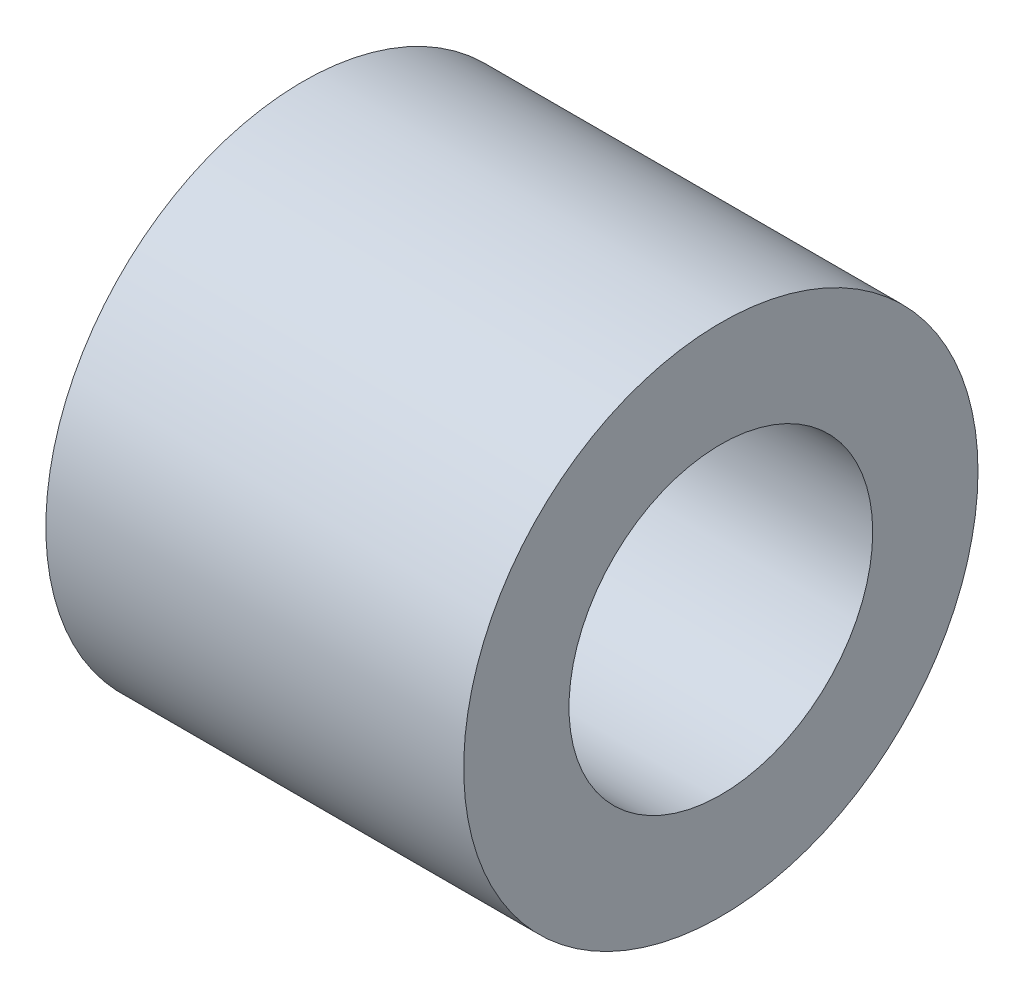
ISO-10303-21;
HEADER;
FILE_DESCRIPTION(('STEP AP214'),'2;1');
FILE_NAME('part.step','',(''),(''),'','','');
FILE_SCHEMA(('AUTOMOTIVE_DESIGN { 1 0 10303 214 1 1 1 1 }'));
ENDSEC;
DATA;
#1=APPLICATION_CONTEXT('core data for automotive mechanical design processes');
#2=APPLICATION_PROTOCOL_DEFINITION('international standard','automotive_design',2000,#1);
#3=PRODUCT_CONTEXT('',#1,'mechanical');
#4=PRODUCT('Part','Part','',(#3));
#5=PRODUCT_RELATED_PRODUCT_CATEGORY('part','',(#4));
#6=PRODUCT_DEFINITION_FORMATION('','',#4);
#7=PRODUCT_DEFINITION_CONTEXT('part definition',#1,'design');
#8=PRODUCT_DEFINITION('design','',#6,#7);
#9=PRODUCT_DEFINITION_SHAPE('','',#8);
#10=(LENGTH_UNIT() NAMED_UNIT(*) SI_UNIT(.MILLI.,.METRE.));
#11=(NAMED_UNIT(*) PLANE_ANGLE_UNIT() SI_UNIT($,.RADIAN.));
#12=(NAMED_UNIT(*) SI_UNIT($,.STERADIAN.) SOLID_ANGLE_UNIT());
#13=UNCERTAINTY_MEASURE_WITH_UNIT(LENGTH_MEASURE(1.E-05),#10,'distance_accuracy_value','');
#14=(GEOMETRIC_REPRESENTATION_CONTEXT(3) GLOBAL_UNCERTAINTY_ASSIGNED_CONTEXT((#13)) GLOBAL_UNIT_ASSIGNED_CONTEXT((#10,
#11,#12)) REPRESENTATION_CONTEXT('',''));
#15=CARTESIAN_POINT('',(0.,0.,0.));
#16=DIRECTION('',(0.,0.,1.));
#17=DIRECTION('',(1.,0.,0.));
#18=AXIS2_PLACEMENT_3D('',#15,#16,#17);
#19=CARTESIAN_POINT('',(-3.175,0.,0.));
#20=DIRECTION('',(1.,0.,0.));
#21=DIRECTION('',(0.,0.,-1.));
#22=AXIS2_PLACEMENT_3D('',#19,#20,#21);
#23=CYLINDRICAL_SURFACE('',#22,3.175);
#24=CARTESIAN_POINT('',(-3.175,0.,0.));
#25=DIRECTION('',(1.,0.,0.));
#26=DIRECTION('',(0.,0.,-1.));
#27=AXIS2_PLACEMENT_3D('',#24,#25,#26);
#28=CIRCLE('',#27,3.175);
#29=CARTESIAN_POINT('',(-3.175,0.,-3.175));
#30=VERTEX_POINT('',#29);
#31=EDGE_CURVE('E51',#30,#30,#28,.T.);
#32=ORIENTED_EDGE('',*,*,#31,.F.);
#33=EDGE_LOOP('',(#32));
#34=FACE_BOUND('',#33,.T.);
#35=CARTESIAN_POINT('',(0.,0.,0.));
#36=DIRECTION('',(1.,0.,0.));
#37=DIRECTION('',(0.,0.,-1.));
#38=AXIS2_PLACEMENT_3D('',#35,#36,#37);
#39=CIRCLE('',#38,3.175);
#40=CARTESIAN_POINT('',(0.,0.,-3.175));
#41=VERTEX_POINT('',#40);
#42=EDGE_CURVE('E46',#41,#41,#39,.T.);
#43=ORIENTED_EDGE('',*,*,#42,.T.);
#44=EDGE_LOOP('',(#43));
#45=FACE_BOUND('',#44,.T.);
#46=ADVANCED_FACE('F43',(#34,#45),#23,.F.);
#47=CARTESIAN_POINT('',(-3.175,0.,0.));
#48=DIRECTION('',(1.,0.,0.));
#49=DIRECTION('',(0.,0.,-1.));
#50=AXIS2_PLACEMENT_3D('',#47,#48,#49);
#51=CYLINDRICAL_SURFACE('',#50,5.08);
#52=CARTESIAN_POINT('',(-3.175,0.,0.));
#53=DIRECTION('',(1.,0.,0.));
#54=DIRECTION('',(0.,0.,-1.));
#55=AXIS2_PLACEMENT_3D('',#52,#53,#54);
#56=CIRCLE('',#55,5.08);
#57=CARTESIAN_POINT('',(-3.175,0.,-5.08));
#58=VERTEX_POINT('',#57);
#59=EDGE_CURVE('E10',#58,#58,#56,.T.);
#60=ORIENTED_EDGE('',*,*,#59,.T.);
#61=EDGE_LOOP('',(#60));
#62=FACE_BOUND('',#61,.T.);
#63=CARTESIAN_POINT('',(5.08,0.,0.));
#64=DIRECTION('',(1.,0.,0.));
#65=DIRECTION('',(0.,0.,-1.));
#66=AXIS2_PLACEMENT_3D('',#63,#64,#65);
#67=CIRCLE('',#66,5.08);
#68=CARTESIAN_POINT('',(5.08,0.,-5.08));
#69=VERTEX_POINT('',#68);
#70=EDGE_CURVE('E61',#69,#69,#67,.T.);
#71=ORIENTED_EDGE('',*,*,#70,.F.);
#72=EDGE_LOOP('',(#71));
#73=FACE_BOUND('',#72,.T.);
#74=ADVANCED_FACE('F79',(#62,#73),#51,.T.);
#75=CARTESIAN_POINT('',(-3.175,0.,0.));
#76=DIRECTION('',(1.,0.,0.));
#77=DIRECTION('',(0.,0.,-1.));
#78=AXIS2_PLACEMENT_3D('',#75,#76,#77);
#79=PLANE('',#78);
#80=ORIENTED_EDGE('',*,*,#31,.T.);
#81=EDGE_LOOP('',(#80));
#82=FACE_BOUND('',#81,.T.);
#83=ORIENTED_EDGE('',*,*,#59,.F.);
#84=EDGE_LOOP('',(#83));
#85=FACE_BOUND('',#84,.T.);
#86=ADVANCED_FACE('F85',(#82,#85),#79,.F.);
#87=CARTESIAN_POINT('',(0.,0.,0.));
#88=DIRECTION('',(1.,0.,0.));
#89=DIRECTION('',(0.,0.,-1.));
#90=AXIS2_PLACEMENT_3D('',#87,#88,#89);
#91=PLANE('',#90);
#92=CARTESIAN_POINT('',(0.,0.,0.));
#93=DIRECTION('',(1.,0.,0.));
#94=DIRECTION('',(0.,0.,-1.));
#95=AXIS2_PLACEMENT_3D('',#92,#93,#94);
#96=CIRCLE('',#95,3.);
#97=CARTESIAN_POINT('',(0.,0.,-3.));
#98=VERTEX_POINT('',#97);
#99=EDGE_CURVE('E59',#98,#98,#96,.T.);
#100=ORIENTED_EDGE('',*,*,#99,.T.);
#101=EDGE_LOOP('',(#100));
#102=FACE_BOUND('',#101,.T.);
#103=ORIENTED_EDGE('',*,*,#42,.F.);
#104=EDGE_LOOP('',(#103));
#105=FACE_BOUND('',#104,.T.);
#106=ADVANCED_FACE('F90',(#102,#105),#91,.F.);
#107=CARTESIAN_POINT('',(5.08,0.,0.));
#108=DIRECTION('',(-1.,0.,0.));
#109=DIRECTION('',(0.,0.,1.));
#110=AXIS2_PLACEMENT_3D('',#107,#108,#109);
#111=CYLINDRICAL_SURFACE('',#110,3.);
#112=CARTESIAN_POINT('',(5.08,0.,0.));
#113=DIRECTION('',(1.,0.,0.));
#114=DIRECTION('',(0.,0.,-1.));
#115=AXIS2_PLACEMENT_3D('',#112,#113,#114);
#116=CIRCLE('',#115,3.);
#117=CARTESIAN_POINT('',(5.08,0.,-3.));
#118=VERTEX_POINT('',#117);
#119=EDGE_CURVE('E65',#118,#118,#116,.T.);
#120=ORIENTED_EDGE('',*,*,#119,.T.);
#121=EDGE_LOOP('',(#120));
#122=FACE_BOUND('',#121,.T.);
#123=ORIENTED_EDGE('',*,*,#99,.F.);
#124=EDGE_LOOP('',(#123));
#125=FACE_BOUND('',#124,.T.);
#126=ADVANCED_FACE('F73',(#122,#125),#111,.F.);
#127=CARTESIAN_POINT('',(5.08,0.,0.));
#128=DIRECTION('',(1.,0.,0.));
#129=DIRECTION('',(0.,0.,-1.));
#130=AXIS2_PLACEMENT_3D('',#127,#128,#129);
#131=PLANE('',#130);
#132=ORIENTED_EDGE('',*,*,#119,.F.);
#133=EDGE_LOOP('',(#132));
#134=FACE_BOUND('',#133,.T.);
#135=ORIENTED_EDGE('',*,*,#70,.T.);
#136=EDGE_LOOP('',(#135));
#137=FACE_BOUND('',#136,.T.);
#138=ADVANCED_FACE('F72',(#134,#137),#131,.T.);
#139=CLOSED_SHELL('',(#46,#74,#86,#106,#126,#138));
#140=MANIFOLD_SOLID_BREP('B2',#139);
#141=ADVANCED_BREP_SHAPE_REPRESENTATION('',(#18,#140),#14);
#142=SHAPE_DEFINITION_REPRESENTATION(#9,#141);
ENDSEC;
END-ISO-10303-21;
